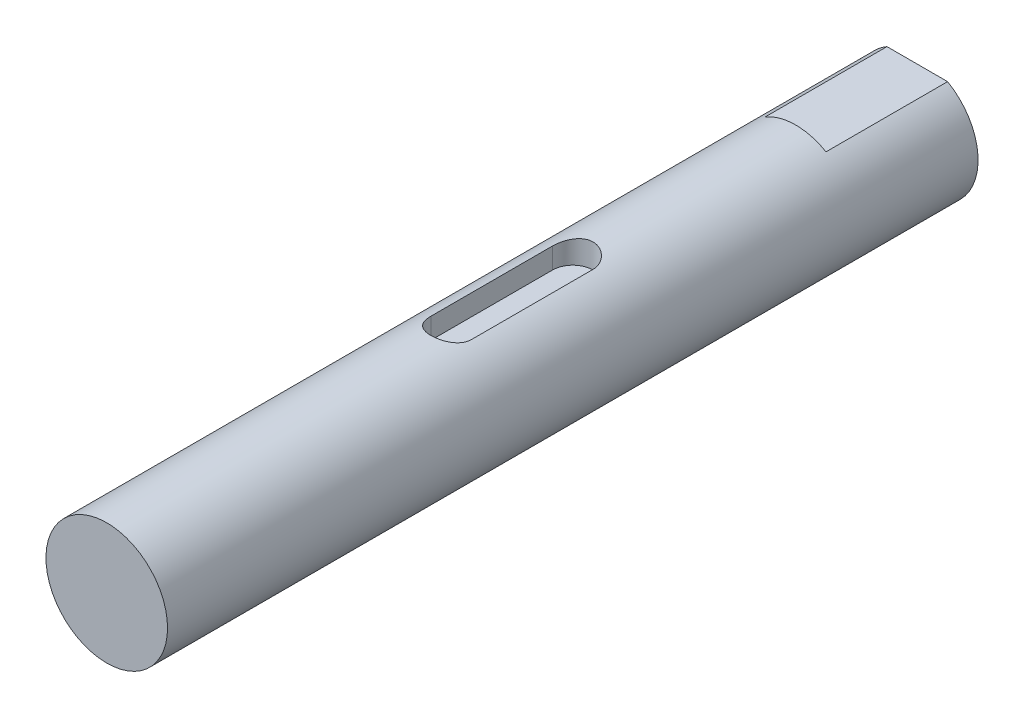
ISO-10303-21;
HEADER;
FILE_DESCRIPTION(('STEP AP214'),'2;1');
FILE_NAME('part.step','',(''),(''),'','','');
FILE_SCHEMA(('AUTOMOTIVE_DESIGN { 1 0 10303 214 1 1 1 1 }'));
ENDSEC;
DATA;
#1=APPLICATION_CONTEXT('core data for automotive mechanical design processes');
#2=APPLICATION_PROTOCOL_DEFINITION('international standard','automotive_design',2000,#1);
#3=PRODUCT_CONTEXT('',#1,'mechanical');
#4=PRODUCT('Part','Part','',(#3));
#5=PRODUCT_RELATED_PRODUCT_CATEGORY('part','',(#4));
#6=PRODUCT_DEFINITION_FORMATION('','',#4);
#7=PRODUCT_DEFINITION_CONTEXT('part definition',#1,'design');
#8=PRODUCT_DEFINITION('design','',#6,#7);
#9=PRODUCT_DEFINITION_SHAPE('','',#8);
#10=(LENGTH_UNIT() NAMED_UNIT(*) SI_UNIT(.MILLI.,.METRE.));
#11=(NAMED_UNIT(*) PLANE_ANGLE_UNIT() SI_UNIT($,.RADIAN.));
#12=(NAMED_UNIT(*) SI_UNIT($,.STERADIAN.) SOLID_ANGLE_UNIT());
#13=UNCERTAINTY_MEASURE_WITH_UNIT(LENGTH_MEASURE(1.E-05),#10,'distance_accuracy_value','');
#14=(GEOMETRIC_REPRESENTATION_CONTEXT(3) GLOBAL_UNCERTAINTY_ASSIGNED_CONTEXT((#13)) GLOBAL_UNIT_ASSIGNED_CONTEXT((#10,
#11,#12)) REPRESENTATION_CONTEXT('',''));
#15=CARTESIAN_POINT('',(0.,0.,0.));
#16=DIRECTION('',(0.,0.,1.));
#17=DIRECTION('',(1.,0.,0.));
#18=AXIS2_PLACEMENT_3D('',#15,#16,#17);
#19=CARTESIAN_POINT('',(0.,7.07106781186548,7.5));
#20=DIRECTION('',(0.,-1.,0.));
#21=DIRECTION('',(0.,0.,-1.));
#22=AXIS2_PLACEMENT_3D('',#19,#20,#21);
#23=CYLINDRICAL_SURFACE('',#22,2.5);
#24=DIRECTION('',(0.,-1.,0.));
#25=VECTOR('',#24,1.);
#26=CARTESIAN_POINT('',(-2.5,4.5,7.5));
#27=LINE('',#26,#25);
#28=CARTESIAN_POINT('',(-2.5,7.07106781186548,7.5));
#29=VERTEX_POINT('',#28);
#30=CARTESIAN_POINT('',(-2.5,4.5,7.5));
#31=VERTEX_POINT('',#30);
#32=EDGE_CURVE('E174',#29,#31,#27,.T.);
#33=ORIENTED_EDGE('',*,*,#32,.F.);
#34=CARTESIAN_POINT('',(2.5,7.07106781186548,7.5));
#35=CARTESIAN_POINT('',(2.50000899154282,7.07105693270503,7.56820713993393));
#36=CARTESIAN_POINT('',(2.49720886733229,7.07205444084989,7.63640819894857));
#37=CARTESIAN_POINT('',(2.48606043221645,7.07598525013897,7.77228128562857));
#38=CARTESIAN_POINT('',(2.47771361899647,7.07891802873099,7.83995345111358));
#39=CARTESIAN_POINT('',(2.45557453400979,7.08662707354274,7.97409079350601));
#40=CARTESIAN_POINT('',(2.44179842347305,7.09139786765818,8.04055894571125));
#41=CARTESIAN_POINT('',(2.40894177361976,7.10262621094713,8.17200838881648));
#42=CARTESIAN_POINT('',(2.38986104270343,7.10908382104694,8.2369896259182));
#43=CARTESIAN_POINT('',(2.32491489772689,7.13069961659174,8.42896342860016));
#44=CARTESIAN_POINT('',(2.27131267419218,7.14811294473447,8.55318274768426));
#45=CARTESIAN_POINT('',(2.14517567710436,7.18697096197062,8.79088011246052));
#46=CARTESIAN_POINT('',(2.07262982361338,7.20841800828457,8.90435181887706));
#47=CARTESIAN_POINT('',(1.90763752637634,7.25385980717432,9.1217832137573));
#48=CARTESIAN_POINT('',(1.81458001304929,7.27791769723887,9.22526694355061));
#49=CARTESIAN_POINT('',(1.61248891950256,7.32534216318208,9.41550200505793));
#50=CARTESIAN_POINT('',(1.50344972134129,7.34870849247481,9.50224742791794));
#51=CARTESIAN_POINT('',(1.26895751987031,7.39285747289025,9.65873460776503));
#52=CARTESIAN_POINT('',(1.14314626508755,7.41355529841144,9.72796513816796));
#53=CARTESIAN_POINT('',(0.880933179990375,7.44925407956136,9.84402594963447));
#54=CARTESIAN_POINT('',(0.74454458697124,7.46426202166911,9.89088372016999));
#55=CARTESIAN_POINT('',(0.506300675160811,7.48354846367395,9.95030940223935));
#56=CARTESIAN_POINT('',(0.406058263098053,7.48968322019279,9.9689048943569));
#57=CARTESIAN_POINT('',(0.203889799829197,7.4979104279263,9.9937519908974));
#58=CARTESIAN_POINT('',(0.101963842394222,7.50000310351862,10.0000042804973));
#59=CARTESIAN_POINT('',(-0.136315986125806,7.49999585088997,9.99999427738118));
#60=CARTESIAN_POINT('',(-0.272699684647469,7.49624588353952,9.98880609079467));
#61=CARTESIAN_POINT('',(-0.541516270817405,7.48163956327938,9.94445372669895));
#62=CARTESIAN_POINT('',(-0.673945698145002,7.47077716655038,9.91127085881357));
#63=CARTESIAN_POINT('',(-0.930836693634848,7.44313156015067,9.82419886938844));
#64=CARTESIAN_POINT('',(-1.05531352521493,7.42636012126861,9.77035089377043));
#65=CARTESIAN_POINT('',(-1.29345159466895,7.38860874187299,9.64363850510157));
#66=CARTESIAN_POINT('',(-1.40711197433489,7.36762846782827,9.57077258482679));
#67=CARTESIAN_POINT('',(-1.62435071469496,7.32285301732122,9.40543812407797));
#68=CARTESIAN_POINT('',(-1.72750303381931,7.29899036528105,9.31242817559876));
#69=CARTESIAN_POINT('',(-1.91707692381706,7.25150917800066,9.11058759059723));
#70=CARTESIAN_POINT('',(-2.00349383736093,7.22789071244168,9.00175256479362));
#71=CARTESIAN_POINT('',(-2.15958968932745,7.18282551254432,8.76749854645059));
#72=CARTESIAN_POINT('',(-2.22870865454547,7.16146193022745,8.64168925520967));
#73=CARTESIAN_POINT('',(-2.34458286297594,7.12437037484559,8.37945021820584));
#74=CARTESIAN_POINT('',(-2.3913606563072,7.10863672323676,8.24303134371887));
#75=CARTESIAN_POINT('',(-2.45056186893758,7.08840130832138,8.00500342672019));
#76=CARTESIAN_POINT('',(-2.4690537709638,7.08195398108499,7.90502988429517));
#77=CARTESIAN_POINT('',(-2.49379018454952,7.07326342629084,7.70339421179849));
#78=CARTESIAN_POINT('',(-2.50003357858266,7.07102058234151,7.60173192850319));
#79=CARTESIAN_POINT('',(-2.5,7.07106781186547,7.5));
#80=B_SPLINE_CURVE_WITH_KNOTS('',3,(#34,#35,#36,#37,#38,#39,#40,#41,#42,#43,#44,#45,#46,#47,#48,
#49,#50,#51,#52,#53,#54,#55,#56,#57,#58,#59,#60,#61,#62,#63,#64,#65,#66,#67,#68,#69,#70,#71,#72,
#73,#74,#75,#76,#77,#78,#79),.UNSPECIFIED.,.F.,.F.,(4,2,2,2,2,2,2,2,2,2,2,2,2,2,2,2,2,2,2,2,2,2,
4),(0.,0.204546398102026,0.40903758818214,0.612924617870061,0.816819012795122,1.22401605540315,
1.63145179899784,2.05324184222862,2.47518051186476,2.90829493949189,3.34087581993438,
3.64649798957412,3.95210319350832,4.36066836463331,4.76958116722893,5.17768398005345,
5.58581914596394,6.00670810862917,6.42771403353709,6.86096580390003,7.29377934142593,
7.59860513192066,7.90345873274272),.UNSPECIFIED.);
#81=CARTESIAN_POINT('',(2.5,7.07106781186548,7.5));
#82=VERTEX_POINT('',#81);
#83=EDGE_CURVE('E11',#29,#82,#80,.F.);
#84=ORIENTED_EDGE('',*,*,#83,.T.);
#85=DIRECTION('',(0.,-1.,0.));
#86=VECTOR('',#85,1.);
#87=CARTESIAN_POINT('',(2.5,4.5,7.5));
#88=LINE('',#87,#86);
#89=CARTESIAN_POINT('',(2.5,4.5,7.5));
#90=VERTEX_POINT('',#89);
#91=EDGE_CURVE('E209',#90,#82,#88,.F.);
#92=ORIENTED_EDGE('',*,*,#91,.F.);
#93=CARTESIAN_POINT('',(0.,4.5,7.5));
#94=DIRECTION('',(0.,-1.,0.));
#95=DIRECTION('',(0.,0.,-1.));
#96=AXIS2_PLACEMENT_3D('',#93,#94,#95);
#97=CIRCLE('',#96,2.5);
#98=EDGE_CURVE('E56',#31,#90,#97,.F.);
#99=ORIENTED_EDGE('',*,*,#98,.F.);
#100=EDGE_LOOP('',(#33,#84,#92,#99));
#101=FACE_BOUND('',#100,.T.);
#102=ADVANCED_FACE('F42',(#101),#23,.F.);
#103=CARTESIAN_POINT('',(0.,4.5,-7.5));
#104=DIRECTION('',(0.,-1.,0.));
#105=DIRECTION('',(0.,0.,-1.));
#106=AXIS2_PLACEMENT_3D('',#103,#104,#105);
#107=CYLINDRICAL_SURFACE('',#106,2.5);
#108=DIRECTION('',(0.,1.,0.));
#109=VECTOR('',#108,1.);
#110=CARTESIAN_POINT('',(-2.5,4.5,-7.5));
#111=LINE('',#110,#109);
#112=CARTESIAN_POINT('',(-2.5,4.5,-7.5));
#113=VERTEX_POINT('',#112);
#114=CARTESIAN_POINT('',(-2.5,7.07106781186548,-7.50000000000001));
#115=VERTEX_POINT('',#114);
#116=EDGE_CURVE('E159',#113,#115,#111,.T.);
#117=ORIENTED_EDGE('',*,*,#116,.F.);
#118=CARTESIAN_POINT('',(0.,4.5,-7.5));
#119=DIRECTION('',(0.,-1.,0.));
#120=DIRECTION('',(0.,0.,-1.));
#121=AXIS2_PLACEMENT_3D('',#118,#119,#120);
#122=CIRCLE('',#121,2.5);
#123=CARTESIAN_POINT('',(2.5,4.5,-7.5));
#124=VERTEX_POINT('',#123);
#125=EDGE_CURVE('E165',#124,#113,#122,.F.);
#126=ORIENTED_EDGE('',*,*,#125,.F.);
#127=DIRECTION('',(0.,1.,0.));
#128=VECTOR('',#127,1.);
#129=CARTESIAN_POINT('',(2.5,4.5,-7.5));
#130=LINE('',#129,#128);
#131=CARTESIAN_POINT('',(2.5,7.07106781186548,-7.5));
#132=VERTEX_POINT('',#131);
#133=EDGE_CURVE('E162',#132,#124,#130,.F.);
#134=ORIENTED_EDGE('',*,*,#133,.F.);
#135=CARTESIAN_POINT('',(-2.5,7.07106781186548,-7.50000000000001));
#136=CARTESIAN_POINT('',(-2.50000899154282,7.07105693270503,-7.56820713993393));
#137=CARTESIAN_POINT('',(-2.49720886733229,7.07205444084989,-7.63640819894858));
#138=CARTESIAN_POINT('',(-2.48606043221645,7.07598525013897,-7.77228128562858));
#139=CARTESIAN_POINT('',(-2.47771361899647,7.078918028731,-7.83995345111359));
#140=CARTESIAN_POINT('',(-2.45557453400978,7.08662707354275,-7.97409079350602));
#141=CARTESIAN_POINT('',(-2.44179842347304,7.09139786765818,-8.04055894571125));
#142=CARTESIAN_POINT('',(-2.40894177361976,7.10262621094713,-8.17200838881648));
#143=CARTESIAN_POINT('',(-2.38986104270343,7.10908382104694,-8.2369896259182));
#144=CARTESIAN_POINT('',(-2.32491489772689,7.13069961659174,-8.42896342860017));
#145=CARTESIAN_POINT('',(-2.27131267419217,7.14811294473447,-8.55318274768428));
#146=CARTESIAN_POINT('',(-2.14517567710435,7.18697096197062,-8.79088011246053));
#147=CARTESIAN_POINT('',(-2.07262982361338,7.20841800828457,-8.90435181887707));
#148=CARTESIAN_POINT('',(-1.90763752637633,7.25385980717432,-9.12178321375731));
#149=CARTESIAN_POINT('',(-1.81458001304929,7.27791769723887,-9.22526694355061));
#150=CARTESIAN_POINT('',(-1.61248891950256,7.32534216318208,-9.41550200505793));
#151=CARTESIAN_POINT('',(-1.50344972134129,7.34870849247481,-9.50224742791794));
#152=CARTESIAN_POINT('',(-1.26895751987029,7.39285747289026,-9.65873460776505));
#153=CARTESIAN_POINT('',(-1.14314626508752,7.41355529841144,-9.72796513816798));
#154=CARTESIAN_POINT('',(-0.880933179990324,7.44925407956137,-9.84402594963449));
#155=CARTESIAN_POINT('',(-0.744544586971196,7.46426202166912,-9.89088372017));
#156=CARTESIAN_POINT('',(-0.506300675171235,7.48354846367311,-9.95030940223675));
#157=CARTESIAN_POINT('',(-0.406058263119266,7.48968322019149,-9.96890489435296));
#158=CARTESIAN_POINT('',(-0.203889799872167,7.49791042792499,-9.99375199089345));
#159=CARTESIAN_POINT('',(-0.101963842448161,7.50000310351774,-10.0000042804946));
#160=CARTESIAN_POINT('',(0.136315986060656,7.49999585089115,-9.99999427738471));
#161=CARTESIAN_POINT('',(0.272699684582235,7.49624588354189,-9.9888060908018));
#162=CARTESIAN_POINT('',(0.541516270752678,7.48163956328407,-9.94445372671328));
#163=CARTESIAN_POINT('',(0.673945698080863,7.47077716655618,-9.91127085883148));
#164=CARTESIAN_POINT('',(0.930836693572494,7.44313156015848,-9.82419886941339));
#165=CARTESIAN_POINT('',(1.05531352515377,7.42636012127733,-9.77035089379885));
#166=CARTESIAN_POINT('',(1.29345159461072,7.3886087418832,-9.6436385051367));
#167=CARTESIAN_POINT('',(1.40711197427838,7.36762846783909,-9.57077258486516));
#168=CARTESIAN_POINT('',(1.62435071464233,7.32285301733293,-9.4054381241228));
#169=CARTESIAN_POINT('',(1.72750303376885,7.29899036529302,-9.3124281756468));
#170=CARTESIAN_POINT('',(1.9170769237715,7.25150917801274,-9.11058759065142));
#171=CARTESIAN_POINT('',(2.00349383731807,7.22789071245359,-9.00175256485074));
#172=CARTESIAN_POINT('',(2.15958968929094,7.18282551255534,-8.76749854651279));
#173=CARTESIAN_POINT('',(2.22870865451253,7.16146193023773,-8.64168925527395));
#174=CARTESIAN_POINT('',(2.34458286295049,7.12437037485399,-8.37945021827366));
#175=CARTESIAN_POINT('',(2.39136065628567,7.10863672324403,-8.24303134378815));
#176=CARTESIAN_POINT('',(2.45056186892583,7.08840130832547,-8.00500342677963));
#177=CARTESIAN_POINT('',(2.46905377095642,7.08195398108758,-7.90502988434312));
#178=CARTESIAN_POINT('',(2.49379018454803,7.07326342629136,-7.70339421182281));
#179=CARTESIAN_POINT('',(2.50003357858269,7.07102058234149,-7.60173192851536));
#180=CARTESIAN_POINT('',(2.5,7.07106781186547,-7.5));
#181=B_SPLINE_CURVE_WITH_KNOTS('',3,(#135,#136,#137,#138,#139,#140,#141,#142,#143,#144,#145,
#146,#147,#148,#149,#150,#151,#152,#153,#154,#155,#156,#157,#158,#159,#160,#161,#162,#163,#164,
#165,#166,#167,#168,#169,#170,#171,#172,#173,#174,#175,#176,#177,#178,#179,#180),.UNSPECIFIED.,
.F.,.F.,(4,2,2,2,2,2,2,2,2,2,2,2,2,2,2,2,2,2,2,2,2,2,4),(0.,0.204546398102026,0.409037588182142,
0.612924617870061,0.816819012795124,1.22401605540316,1.63145179899785,2.05324184222861,
2.47518051186477,2.90829493949195,3.34087581993439,3.64649798954182,3.95210319344372,
4.36066836456747,4.76958116716193,5.1776839799853,5.58581914589462,6.00670810855816,
6.42771403346439,6.86096580382735,7.29377934135335,7.59860513188426,7.90345873274273),.UNSPECIFIED.);
#182=EDGE_CURVE('E167',#132,#115,#181,.F.);
#183=ORIENTED_EDGE('',*,*,#182,.T.);
#184=EDGE_LOOP('',(#117,#126,#134,#183));
#185=FACE_BOUND('',#184,.T.);
#186=ADVANCED_FACE('F179',(#185),#107,.F.);
#187=CARTESIAN_POINT('',(0.,0.,50.));
#188=DIRECTION('',(0.,0.,-1.));
#189=DIRECTION('',(-1.,0.,0.));
#190=AXIS2_PLACEMENT_3D('',#187,#188,#189);
#191=CYLINDRICAL_SURFACE('',#190,7.5);
#192=ORIENTED_EDGE('',*,*,#83,.F.);
#193=DIRECTION('',(0.,0.,-1.));
#194=VECTOR('',#193,1.);
#195=CARTESIAN_POINT('',(-2.5,7.07106781186548,50.));
#196=LINE('',#195,#194);
#197=EDGE_CURVE('E157',#29,#115,#196,.T.);
#198=ORIENTED_EDGE('',*,*,#197,.T.);
#199=ORIENTED_EDGE('',*,*,#182,.F.);
#200=DIRECTION('',(0.,0.,-1.));
#201=VECTOR('',#200,1.);
#202=CARTESIAN_POINT('',(2.5,7.07106781186548,50.));
#203=LINE('',#202,#201);
#204=EDGE_CURVE('E152',#132,#82,#203,.F.);
#205=ORIENTED_EDGE('',*,*,#204,.T.);
#206=EDGE_LOOP('',(#192,#198,#199,#205));
#207=FACE_BOUND('',#206,.T.);
#208=CARTESIAN_POINT('',(0.,0.,50.));
#209=DIRECTION('',(0.,0.,1.));
#210=DIRECTION('',(1.,0.,0.));
#211=AXIS2_PLACEMENT_3D('',#208,#209,#210);
#212=CIRCLE('',#211,7.5);
#213=CARTESIAN_POINT('',(7.5,0.,50.));
#214=VERTEX_POINT('',#213);
#215=EDGE_CURVE('E149',#214,#214,#212,.T.);
#216=ORIENTED_EDGE('',*,*,#215,.F.);
#217=EDGE_LOOP('',(#216));
#218=FACE_BOUND('',#217,.T.);
#219=CARTESIAN_POINT('',(0.,0.,-35.));
#220=DIRECTION('',(0.,0.,-1.));
#221=DIRECTION('',(-1.,0.,0.));
#222=AXIS2_PLACEMENT_3D('',#219,#220,#221);
#223=CIRCLE('',#222,7.5);
#224=CARTESIAN_POINT('',(-3.74165738677394,6.5,-35.));
#225=VERTEX_POINT('',#224);
#226=CARTESIAN_POINT('',(3.74165738677394,6.5,-35.));
#227=VERTEX_POINT('',#226);
#228=EDGE_CURVE('E114',#225,#227,#223,.T.);
#229=ORIENTED_EDGE('',*,*,#228,.F.);
#230=DIRECTION('',(0.,0.,-1.));
#231=VECTOR('',#230,1.);
#232=CARTESIAN_POINT('',(-3.74165738677394,6.5,-35.));
#233=LINE('',#232,#231);
#234=CARTESIAN_POINT('',(-3.74165738677394,6.5,-50.));
#235=VERTEX_POINT('',#234);
#236=EDGE_CURVE('E122',#225,#235,#233,.T.);
#237=ORIENTED_EDGE('',*,*,#236,.T.);
#238=CARTESIAN_POINT('',(0.,0.,-50.));
#239=DIRECTION('',(0.,0.,1.));
#240=DIRECTION('',(1.,0.,0.));
#241=AXIS2_PLACEMENT_3D('',#238,#239,#240);
#242=CIRCLE('',#241,7.5);
#243=CARTESIAN_POINT('',(-6.5,3.74165738677394,-50.));
#244=VERTEX_POINT('',#243);
#245=EDGE_CURVE('E153',#235,#244,#242,.T.);
#246=ORIENTED_EDGE('',*,*,#245,.T.);
#247=DIRECTION('',(0.,0.,-1.));
#248=VECTOR('',#247,1.);
#249=CARTESIAN_POINT('',(-6.5,3.74165738677394,-35.));
#250=LINE('',#249,#248);
#251=CARTESIAN_POINT('',(-6.5,3.74165738677394,-35.));
#252=VERTEX_POINT('',#251);
#253=EDGE_CURVE('E63',#252,#244,#250,.T.);
#254=ORIENTED_EDGE('',*,*,#253,.F.);
#255=CARTESIAN_POINT('',(0.,0.,-35.));
#256=DIRECTION('',(0.,0.,-1.));
#257=DIRECTION('',(-1.,0.,0.));
#258=AXIS2_PLACEMENT_3D('',#255,#256,#257);
#259=CIRCLE('',#258,7.5);
#260=CARTESIAN_POINT('',(-6.5,-3.74165738677394,-35.));
#261=VERTEX_POINT('',#260);
#262=EDGE_CURVE('E140',#261,#252,#259,.T.);
#263=ORIENTED_EDGE('',*,*,#262,.F.);
#264=DIRECTION('',(0.,0.,-1.));
#265=VECTOR('',#264,1.);
#266=CARTESIAN_POINT('',(-6.5,-3.74165738677394,-35.));
#267=LINE('',#266,#265);
#268=CARTESIAN_POINT('',(-6.5,-3.74165738677394,-50.));
#269=VERTEX_POINT('',#268);
#270=EDGE_CURVE('E136',#261,#269,#267,.T.);
#271=ORIENTED_EDGE('',*,*,#270,.T.);
#272=CARTESIAN_POINT('',(3.74165738677394,6.5,-50.));
#273=VERTEX_POINT('',#272);
#274=EDGE_CURVE('E128',#269,#273,#242,.T.);
#275=ORIENTED_EDGE('',*,*,#274,.T.);
#276=DIRECTION('',(0.,0.,-1.));
#277=VECTOR('',#276,1.);
#278=CARTESIAN_POINT('',(3.74165738677394,6.5,-35.));
#279=LINE('',#278,#277);
#280=EDGE_CURVE('E71',#227,#273,#279,.T.);
#281=ORIENTED_EDGE('',*,*,#280,.F.);
#282=EDGE_LOOP('',(#229,#237,#246,#254,#263,#271,#275,#281));
#283=FACE_BOUND('',#282,.T.);
#284=ADVANCED_FACE('F125',(#207,#218,#283),#191,.T.);
#285=CARTESIAN_POINT('',(0.,0.,50.));
#286=DIRECTION('',(0.,0.,1.));
#287=DIRECTION('',(1.,0.,0.));
#288=AXIS2_PLACEMENT_3D('',#285,#286,#287);
#289=PLANE('',#288);
#290=ORIENTED_EDGE('',*,*,#215,.T.);
#291=EDGE_LOOP('',(#290));
#292=FACE_BOUND('',#291,.T.);
#293=ADVANCED_FACE('F190',(#292),#289,.T.);
#294=CARTESIAN_POINT('',(0.,0.,-50.));
#295=DIRECTION('',(0.,0.,1.));
#296=DIRECTION('',(1.,0.,0.));
#297=AXIS2_PLACEMENT_3D('',#294,#295,#296);
#298=PLANE('',#297);
#299=ORIENTED_EDGE('',*,*,#245,.F.);
#300=DIRECTION('',(-1.,0.,0.));
#301=VECTOR('',#300,1.);
#302=CARTESIAN_POINT('',(3.74165738677394,6.5,-50.));
#303=LINE('',#302,#301);
#304=EDGE_CURVE('E119',#273,#235,#303,.T.);
#305=ORIENTED_EDGE('',*,*,#304,.F.);
#306=ORIENTED_EDGE('',*,*,#274,.F.);
#307=DIRECTION('',(0.,-1.,0.));
#308=VECTOR('',#307,1.);
#309=CARTESIAN_POINT('',(-6.5,-3.74165738677394,-50.));
#310=LINE('',#309,#308);
#311=EDGE_CURVE('E138',#244,#269,#310,.T.);
#312=ORIENTED_EDGE('',*,*,#311,.F.);
#313=EDGE_LOOP('',(#299,#305,#306,#312));
#314=FACE_BOUND('',#313,.T.);
#315=ADVANCED_FACE('F213',(#314),#298,.F.);
#316=CARTESIAN_POINT('',(-2.5,4.5,-10.));
#317=DIRECTION('',(-1.,0.,0.));
#318=DIRECTION('',(0.,0.,1.));
#319=AXIS2_PLACEMENT_3D('',#316,#317,#318);
#320=PLANE('',#319);
#321=ORIENTED_EDGE('',*,*,#197,.F.);
#322=ORIENTED_EDGE('',*,*,#32,.T.);
#323=DIRECTION('',(0.,0.,1.));
#324=VECTOR('',#323,1.);
#325=CARTESIAN_POINT('',(-2.5,4.5,-10.));
#326=LINE('',#325,#324);
#327=EDGE_CURVE('E130',#113,#31,#326,.T.);
#328=ORIENTED_EDGE('',*,*,#327,.F.);
#329=ORIENTED_EDGE('',*,*,#116,.T.);
#330=EDGE_LOOP('',(#321,#322,#328,#329));
#331=FACE_BOUND('',#330,.T.);
#332=ADVANCED_FACE('F199',(#331),#320,.F.);
#333=CARTESIAN_POINT('',(2.5,4.5,-10.));
#334=DIRECTION('',(1.,0.,0.));
#335=DIRECTION('',(0.,0.,-1.));
#336=AXIS2_PLACEMENT_3D('',#333,#334,#335);
#337=PLANE('',#336);
#338=DIRECTION('',(0.,0.,1.));
#339=VECTOR('',#338,1.);
#340=CARTESIAN_POINT('',(2.5,4.5,-10.));
#341=LINE('',#340,#339);
#342=EDGE_CURVE('E144',#124,#90,#341,.T.);
#343=ORIENTED_EDGE('',*,*,#342,.T.);
#344=ORIENTED_EDGE('',*,*,#91,.T.);
#345=ORIENTED_EDGE('',*,*,#204,.F.);
#346=ORIENTED_EDGE('',*,*,#133,.T.);
#347=EDGE_LOOP('',(#343,#344,#345,#346));
#348=FACE_BOUND('',#347,.T.);
#349=ADVANCED_FACE('F207',(#348),#337,.F.);
#350=CARTESIAN_POINT('',(-2.5,4.5,-10.));
#351=DIRECTION('',(0.,-1.,0.));
#352=DIRECTION('',(0.,0.,-1.));
#353=AXIS2_PLACEMENT_3D('',#350,#351,#352);
#354=PLANE('',#353);
#355=ORIENTED_EDGE('',*,*,#327,.T.);
#356=ORIENTED_EDGE('',*,*,#98,.T.);
#357=ORIENTED_EDGE('',*,*,#342,.F.);
#358=ORIENTED_EDGE('',*,*,#125,.T.);
#359=EDGE_LOOP('',(#355,#356,#357,#358));
#360=FACE_BOUND('',#359,.T.);
#361=ADVANCED_FACE('F202',(#360),#354,.F.);
#362=CARTESIAN_POINT('',(-6.5,-3.74165738677394,-35.));
#363=DIRECTION('',(1.,0.,0.));
#364=DIRECTION('',(0.,0.,-1.));
#365=AXIS2_PLACEMENT_3D('',#362,#363,#364);
#366=PLANE('',#365);
#367=ORIENTED_EDGE('',*,*,#311,.T.);
#368=ORIENTED_EDGE('',*,*,#270,.F.);
#369=DIRECTION('',(0.,-1.,0.));
#370=VECTOR('',#369,1.);
#371=CARTESIAN_POINT('',(-6.5,-3.74165738677394,-35.));
#372=LINE('',#371,#370);
#373=EDGE_CURVE('E135',#252,#261,#372,.T.);
#374=ORIENTED_EDGE('',*,*,#373,.F.);
#375=ORIENTED_EDGE('',*,*,#253,.T.);
#376=EDGE_LOOP('',(#367,#368,#374,#375));
#377=FACE_BOUND('',#376,.T.);
#378=ADVANCED_FACE('F224',(#377),#366,.F.);
#379=CARTESIAN_POINT('',(0.,0.,-35.));
#380=DIRECTION('',(0.,0.,-1.));
#381=DIRECTION('',(-1.,0.,0.));
#382=AXIS2_PLACEMENT_3D('',#379,#380,#381);
#383=PLANE('',#382);
#384=ORIENTED_EDGE('',*,*,#262,.T.);
#385=ORIENTED_EDGE('',*,*,#373,.T.);
#386=EDGE_LOOP('',(#384,#385));
#387=FACE_BOUND('',#386,.T.);
#388=ADVANCED_FACE('F227',(#387),#383,.T.);
#389=CARTESIAN_POINT('',(3.74165738677394,6.5,-35.));
#390=DIRECTION('',(0.,-1.,0.));
#391=DIRECTION('',(0.,0.,-1.));
#392=AXIS2_PLACEMENT_3D('',#389,#390,#391);
#393=PLANE('',#392);
#394=ORIENTED_EDGE('',*,*,#304,.T.);
#395=ORIENTED_EDGE('',*,*,#236,.F.);
#396=DIRECTION('',(-1.,0.,0.));
#397=VECTOR('',#396,1.);
#398=CARTESIAN_POINT('',(3.74165738677394,6.5,-35.));
#399=LINE('',#398,#397);
#400=EDGE_CURVE('E116',#227,#225,#399,.T.);
#401=ORIENTED_EDGE('',*,*,#400,.F.);
#402=ORIENTED_EDGE('',*,*,#280,.T.);
#403=EDGE_LOOP('',(#394,#395,#401,#402));
#404=FACE_BOUND('',#403,.T.);
#405=ADVANCED_FACE('F121',(#404),#393,.F.);
#406=CARTESIAN_POINT('',(0.,0.,-35.));
#407=DIRECTION('',(0.,0.,-1.));
#408=DIRECTION('',(-1.,0.,0.));
#409=AXIS2_PLACEMENT_3D('',#406,#407,#408);
#410=PLANE('',#409);
#411=ORIENTED_EDGE('',*,*,#228,.T.);
#412=ORIENTED_EDGE('',*,*,#400,.T.);
#413=EDGE_LOOP('',(#411,#412));
#414=FACE_BOUND('',#413,.T.);
#415=ADVANCED_FACE('F115',(#414),#410,.T.);
#416=CLOSED_SHELL('',(#102,#186,#284,#293,#315,#332,#349,#361,#378,#388,#405,#415));
#417=MANIFOLD_SOLID_BREP('B2',#416);
#418=ADVANCED_BREP_SHAPE_REPRESENTATION('',(#18,#417),#14);
#419=SHAPE_DEFINITION_REPRESENTATION(#9,#418);
ENDSEC;
END-ISO-10303-21;
